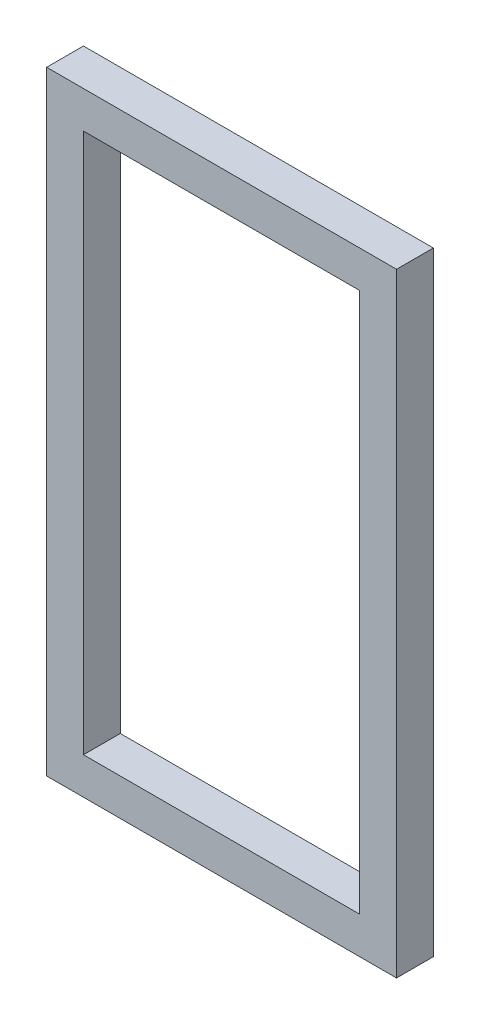
ISO-10303-21;
HEADER;
FILE_DESCRIPTION(('STEP AP214'),'2;1');
FILE_NAME('part.step','',(''),(''),'','','');
FILE_SCHEMA(('AUTOMOTIVE_DESIGN { 1 0 10303 214 1 1 1 1 }'));
ENDSEC;
DATA;
#1=APPLICATION_CONTEXT('core data for automotive mechanical design processes');
#2=APPLICATION_PROTOCOL_DEFINITION('international standard','automotive_design',2000,#1);
#3=PRODUCT_CONTEXT('',#1,'mechanical');
#4=PRODUCT('Part','Part','',(#3));
#5=PRODUCT_RELATED_PRODUCT_CATEGORY('part','',(#4));
#6=PRODUCT_DEFINITION_FORMATION('','',#4);
#7=PRODUCT_DEFINITION_CONTEXT('part definition',#1,'design');
#8=PRODUCT_DEFINITION('design','',#6,#7);
#9=PRODUCT_DEFINITION_SHAPE('','',#8);
#10=(LENGTH_UNIT() NAMED_UNIT(*) SI_UNIT(.MILLI.,.METRE.));
#11=(NAMED_UNIT(*) PLANE_ANGLE_UNIT() SI_UNIT($,.RADIAN.));
#12=(NAMED_UNIT(*) SI_UNIT($,.STERADIAN.) SOLID_ANGLE_UNIT());
#13=UNCERTAINTY_MEASURE_WITH_UNIT(LENGTH_MEASURE(1.E-05),#10,'distance_accuracy_value','');
#14=(GEOMETRIC_REPRESENTATION_CONTEXT(3) GLOBAL_UNCERTAINTY_ASSIGNED_CONTEXT((#13)) GLOBAL_UNIT_ASSIGNED_CONTEXT((#10,
#11,#12)) REPRESENTATION_CONTEXT('',''));
#15=CARTESIAN_POINT('',(0.,0.,0.));
#16=DIRECTION('',(0.,0.,1.));
#17=DIRECTION('',(1.,0.,0.));
#18=AXIS2_PLACEMENT_3D('',#15,#16,#17);
#19=CARTESIAN_POINT('',(-285.,850.,-1395.));
#20=DIRECTION('',(0.,0.,1.));
#21=DIRECTION('',(0.,-1.,0.));
#22=AXIS2_PLACEMENT_3D('',#19,#20,#21);
#23=PLANE('',#22);
#24=DIRECTION('',(0.,-1.,0.));
#25=VECTOR('',#24,1.);
#26=CARTESIAN_POINT('',(-285.,1850.,-1395.));
#27=LINE('',#26,#25);
#28=CARTESIAN_POINT('',(-285.,1850.,-1395.));
#29=VERTEX_POINT('',#28);
#30=CARTESIAN_POINT('',(-285.,850.,-1395.));
#31=VERTEX_POINT('',#30);
#32=EDGE_CURVE('E108',#29,#31,#27,.T.);
#33=ORIENTED_EDGE('',*,*,#32,.T.);
#34=DIRECTION('',(1.,0.,0.));
#35=VECTOR('',#34,1.);
#36=CARTESIAN_POINT('',(-285.,850.,-1395.));
#37=LINE('',#36,#35);
#38=CARTESIAN_POINT('',(285.,850.,-1395.));
#39=VERTEX_POINT('',#38);
#40=EDGE_CURVE('E110',#31,#39,#37,.T.);
#41=ORIENTED_EDGE('',*,*,#40,.T.);
#42=DIRECTION('',(0.,1.,0.));
#43=VECTOR('',#42,1.);
#44=CARTESIAN_POINT('',(285.,850.,-1395.));
#45=LINE('',#44,#43);
#46=CARTESIAN_POINT('',(285.,1850.,-1395.));
#47=VERTEX_POINT('',#46);
#48=EDGE_CURVE('E112',#39,#47,#45,.T.);
#49=ORIENTED_EDGE('',*,*,#48,.T.);
#50=DIRECTION('',(-1.,0.,0.));
#51=VECTOR('',#50,1.);
#52=CARTESIAN_POINT('',(285.,1850.,-1395.));
#53=LINE('',#52,#51);
#54=EDGE_CURVE('E114',#47,#29,#53,.T.);
#55=ORIENTED_EDGE('',*,*,#54,.T.);
#56=EDGE_LOOP('',(#33,#41,#49,#55));
#57=FACE_BOUND('',#56,.T.);
#58=DIRECTION('',(-1.,0.,0.));
#59=VECTOR('',#58,1.);
#60=CARTESIAN_POINT('',(-285.,910.,-1395.));
#61=LINE('',#60,#59);
#62=CARTESIAN_POINT('',(225.,910.,-1395.));
#63=VERTEX_POINT('',#62);
#64=CARTESIAN_POINT('',(-225.,910.,-1395.));
#65=VERTEX_POINT('',#64);
#66=EDGE_CURVE('E95',#63,#65,#61,.T.);
#67=ORIENTED_EDGE('',*,*,#66,.T.);
#68=DIRECTION('',(0.,1.,0.));
#69=VECTOR('',#68,1.);
#70=CARTESIAN_POINT('',(-225.,850.,-1395.));
#71=LINE('',#70,#69);
#72=CARTESIAN_POINT('',(-225.,1790.,-1395.));
#73=VERTEX_POINT('',#72);
#74=EDGE_CURVE('E89',#65,#73,#71,.T.);
#75=ORIENTED_EDGE('',*,*,#74,.T.);
#76=DIRECTION('',(1.,0.,0.));
#77=VECTOR('',#76,1.);
#78=CARTESIAN_POINT('',(-285.,1790.,-1395.));
#79=LINE('',#78,#77);
#80=CARTESIAN_POINT('',(225.,1790.,-1395.));
#81=VERTEX_POINT('',#80);
#82=EDGE_CURVE('E78',#73,#81,#79,.T.);
#83=ORIENTED_EDGE('',*,*,#82,.T.);
#84=DIRECTION('',(0.,-1.,0.));
#85=VECTOR('',#84,1.);
#86=CARTESIAN_POINT('',(225.,850.,-1395.));
#87=LINE('',#86,#85);
#88=EDGE_CURVE('E83',#81,#63,#87,.T.);
#89=ORIENTED_EDGE('',*,*,#88,.T.);
#90=EDGE_LOOP('',(#67,#75,#83,#89));
#91=FACE_BOUND('',#90,.T.);
#92=ADVANCED_FACE('F17',(#57,#91),#23,.T.);
#93=CARTESIAN_POINT('',(-285.,850.,-1455.));
#94=DIRECTION('',(0.,0.,1.));
#95=DIRECTION('',(0.,-1.,0.));
#96=AXIS2_PLACEMENT_3D('',#93,#94,#95);
#97=PLANE('',#96);
#98=DIRECTION('',(0.,-1.,0.));
#99=VECTOR('',#98,1.);
#100=CARTESIAN_POINT('',(-285.,1850.,-1455.));
#101=LINE('',#100,#99);
#102=CARTESIAN_POINT('',(-285.,1850.,-1455.));
#103=VERTEX_POINT('',#102);
#104=CARTESIAN_POINT('',(-285.,850.,-1455.));
#105=VERTEX_POINT('',#104);
#106=EDGE_CURVE('E96',#103,#105,#101,.T.);
#107=ORIENTED_EDGE('',*,*,#106,.F.);
#108=DIRECTION('',(-1.,0.,0.));
#109=VECTOR('',#108,1.);
#110=CARTESIAN_POINT('',(285.,1850.,-1455.));
#111=LINE('',#110,#109);
#112=CARTESIAN_POINT('',(285.,1850.,-1455.));
#113=VERTEX_POINT('',#112);
#114=EDGE_CURVE('E107',#113,#103,#111,.T.);
#115=ORIENTED_EDGE('',*,*,#114,.F.);
#116=DIRECTION('',(0.,1.,0.));
#117=VECTOR('',#116,1.);
#118=CARTESIAN_POINT('',(285.,850.,-1455.));
#119=LINE('',#118,#117);
#120=CARTESIAN_POINT('',(285.,850.,-1455.));
#121=VERTEX_POINT('',#120);
#122=EDGE_CURVE('E105',#121,#113,#119,.T.);
#123=ORIENTED_EDGE('',*,*,#122,.F.);
#124=DIRECTION('',(1.,0.,0.));
#125=VECTOR('',#124,1.);
#126=CARTESIAN_POINT('',(-285.,850.,-1455.));
#127=LINE('',#126,#125);
#128=EDGE_CURVE('E99',#105,#121,#127,.T.);
#129=ORIENTED_EDGE('',*,*,#128,.F.);
#130=EDGE_LOOP('',(#107,#115,#123,#129));
#131=FACE_BOUND('',#130,.T.);
#132=DIRECTION('',(0.,1.,0.));
#133=VECTOR('',#132,1.);
#134=CARTESIAN_POINT('',(-225.,850.,-1455.));
#135=LINE('',#134,#133);
#136=CARTESIAN_POINT('',(-225.,910.,-1455.));
#137=VERTEX_POINT('',#136);
#138=CARTESIAN_POINT('',(-225.,1790.,-1455.));
#139=VERTEX_POINT('',#138);
#140=EDGE_CURVE('E11',#137,#139,#135,.T.);
#141=ORIENTED_EDGE('',*,*,#140,.F.);
#142=DIRECTION('',(-1.,0.,0.));
#143=VECTOR('',#142,1.);
#144=CARTESIAN_POINT('',(-285.,910.,-1455.));
#145=LINE('',#144,#143);
#146=CARTESIAN_POINT('',(225.,910.,-1455.));
#147=VERTEX_POINT('',#146);
#148=EDGE_CURVE('E25',#147,#137,#145,.T.);
#149=ORIENTED_EDGE('',*,*,#148,.F.);
#150=DIRECTION('',(0.,-1.,0.));
#151=VECTOR('',#150,1.);
#152=CARTESIAN_POINT('',(225.,850.,-1455.));
#153=LINE('',#152,#151);
#154=CARTESIAN_POINT('',(225.,1790.,-1455.));
#155=VERTEX_POINT('',#154);
#156=EDGE_CURVE('E132',#155,#147,#153,.T.);
#157=ORIENTED_EDGE('',*,*,#156,.F.);
#158=DIRECTION('',(1.,0.,0.));
#159=VECTOR('',#158,1.);
#160=CARTESIAN_POINT('',(-285.,1790.,-1455.));
#161=LINE('',#160,#159);
#162=EDGE_CURVE('E130',#139,#155,#161,.T.);
#163=ORIENTED_EDGE('',*,*,#162,.F.);
#164=EDGE_LOOP('',(#141,#149,#157,#163));
#165=FACE_BOUND('',#164,.T.);
#166=ADVANCED_FACE('F142',(#131,#165),#97,.F.);
#167=CARTESIAN_POINT('',(-285.,1850.,-1395.));
#168=DIRECTION('',(1.,0.,0.));
#169=DIRECTION('',(0.,1.,0.));
#170=AXIS2_PLACEMENT_3D('',#167,#168,#169);
#171=PLANE('',#170);
#172=ORIENTED_EDGE('',*,*,#106,.T.);
#173=DIRECTION('',(0.,0.,-1.));
#174=VECTOR('',#173,1.);
#175=CARTESIAN_POINT('',(-285.,850.,-1395.));
#176=LINE('',#175,#174);
#177=EDGE_CURVE('E127',#31,#105,#176,.T.);
#178=ORIENTED_EDGE('',*,*,#177,.F.);
#179=ORIENTED_EDGE('',*,*,#32,.F.);
#180=DIRECTION('',(0.,0.,-1.));
#181=VECTOR('',#180,1.);
#182=CARTESIAN_POINT('',(-285.,1850.,-1395.));
#183=LINE('',#182,#181);
#184=EDGE_CURVE('E116',#29,#103,#183,.T.);
#185=ORIENTED_EDGE('',*,*,#184,.T.);
#186=EDGE_LOOP('',(#172,#178,#179,#185));
#187=FACE_BOUND('',#186,.T.);
#188=ADVANCED_FACE('F19',(#187),#171,.F.);
#189=CARTESIAN_POINT('',(-285.,850.,-1395.));
#190=DIRECTION('',(0.,1.,0.));
#191=DIRECTION('',(-1.,0.,0.));
#192=AXIS2_PLACEMENT_3D('',#189,#190,#191);
#193=PLANE('',#192);
#194=ORIENTED_EDGE('',*,*,#128,.T.);
#195=DIRECTION('',(0.,0.,-1.));
#196=VECTOR('',#195,1.);
#197=CARTESIAN_POINT('',(285.,850.,-1395.));
#198=LINE('',#197,#196);
#199=EDGE_CURVE('E124',#39,#121,#198,.T.);
#200=ORIENTED_EDGE('',*,*,#199,.F.);
#201=ORIENTED_EDGE('',*,*,#40,.F.);
#202=ORIENTED_EDGE('',*,*,#177,.T.);
#203=EDGE_LOOP('',(#194,#200,#201,#202));
#204=FACE_BOUND('',#203,.T.);
#205=ADVANCED_FACE('F172',(#204),#193,.F.);
#206=CARTESIAN_POINT('',(285.,850.,-1395.));
#207=DIRECTION('',(-1.,0.,0.));
#208=DIRECTION('',(0.,-1.,0.));
#209=AXIS2_PLACEMENT_3D('',#206,#207,#208);
#210=PLANE('',#209);
#211=ORIENTED_EDGE('',*,*,#122,.T.);
#212=DIRECTION('',(0.,0.,-1.));
#213=VECTOR('',#212,1.);
#214=CARTESIAN_POINT('',(285.,1850.,-1395.));
#215=LINE('',#214,#213);
#216=EDGE_CURVE('E121',#47,#113,#215,.T.);
#217=ORIENTED_EDGE('',*,*,#216,.F.);
#218=ORIENTED_EDGE('',*,*,#48,.F.);
#219=ORIENTED_EDGE('',*,*,#199,.T.);
#220=EDGE_LOOP('',(#211,#217,#218,#219));
#221=FACE_BOUND('',#220,.T.);
#222=ADVANCED_FACE('F169',(#221),#210,.F.);
#223=CARTESIAN_POINT('',(285.,1850.,-1395.));
#224=DIRECTION('',(0.,-1.,0.));
#225=DIRECTION('',(1.,0.,0.));
#226=AXIS2_PLACEMENT_3D('',#223,#224,#225);
#227=PLANE('',#226);
#228=ORIENTED_EDGE('',*,*,#114,.T.);
#229=ORIENTED_EDGE('',*,*,#184,.F.);
#230=ORIENTED_EDGE('',*,*,#54,.F.);
#231=ORIENTED_EDGE('',*,*,#216,.T.);
#232=EDGE_LOOP('',(#228,#229,#230,#231));
#233=FACE_BOUND('',#232,.T.);
#234=ADVANCED_FACE('F166',(#233),#227,.F.);
#235=CARTESIAN_POINT('',(-225.,1790.,910.211487044084));
#236=DIRECTION('',(1.,0.,0.));
#237=DIRECTION('',(0.,1.,0.));
#238=AXIS2_PLACEMENT_3D('',#235,#236,#237);
#239=PLANE('',#238);
#240=DIRECTION('',(0.,0.,-1.));
#241=VECTOR('',#240,1.);
#242=CARTESIAN_POINT('',(-225.,910.,910.211487044084));
#243=LINE('',#242,#241);
#244=EDGE_CURVE('E84',#65,#137,#243,.T.);
#245=ORIENTED_EDGE('',*,*,#244,.T.);
#246=ORIENTED_EDGE('',*,*,#140,.T.);
#247=DIRECTION('',(0.,0.,-1.));
#248=VECTOR('',#247,1.);
#249=CARTESIAN_POINT('',(-225.,1790.,910.211487044084));
#250=LINE('',#249,#248);
#251=EDGE_CURVE('E37',#73,#139,#250,.T.);
#252=ORIENTED_EDGE('',*,*,#251,.F.);
#253=ORIENTED_EDGE('',*,*,#74,.F.);
#254=EDGE_LOOP('',(#245,#246,#252,#253));
#255=FACE_BOUND('',#254,.T.);
#256=ADVANCED_FACE('F88',(#255),#239,.T.);
#257=CARTESIAN_POINT('',(-225.,910.,910.211487044084));
#258=DIRECTION('',(0.,1.,0.));
#259=DIRECTION('',(-1.,0.,0.));
#260=AXIS2_PLACEMENT_3D('',#257,#258,#259);
#261=PLANE('',#260);
#262=DIRECTION('',(0.,0.,-1.));
#263=VECTOR('',#262,1.);
#264=CARTESIAN_POINT('',(225.,910.,910.211487044084));
#265=LINE('',#264,#263);
#266=EDGE_CURVE('E138',#63,#147,#265,.T.);
#267=ORIENTED_EDGE('',*,*,#266,.T.);
#268=ORIENTED_EDGE('',*,*,#148,.T.);
#269=ORIENTED_EDGE('',*,*,#244,.F.);
#270=ORIENTED_EDGE('',*,*,#66,.F.);
#271=EDGE_LOOP('',(#267,#268,#269,#270));
#272=FACE_BOUND('',#271,.T.);
#273=ADVANCED_FACE('F136',(#272),#261,.T.);
#274=CARTESIAN_POINT('',(225.,910.,910.211487044084));
#275=DIRECTION('',(-1.,0.,0.));
#276=DIRECTION('',(0.,-1.,0.));
#277=AXIS2_PLACEMENT_3D('',#274,#275,#276);
#278=PLANE('',#277);
#279=DIRECTION('',(0.,0.,-1.));
#280=VECTOR('',#279,1.);
#281=CARTESIAN_POINT('',(225.,1790.,910.211487044084));
#282=LINE('',#281,#280);
#283=EDGE_CURVE('E32',#81,#155,#282,.T.);
#284=ORIENTED_EDGE('',*,*,#283,.T.);
#285=ORIENTED_EDGE('',*,*,#156,.T.);
#286=ORIENTED_EDGE('',*,*,#266,.F.);
#287=ORIENTED_EDGE('',*,*,#88,.F.);
#288=EDGE_LOOP('',(#284,#285,#286,#287));
#289=FACE_BOUND('',#288,.T.);
#290=ADVANCED_FACE('F144',(#289),#278,.T.);
#291=CARTESIAN_POINT('',(225.,1790.,910.211487044084));
#292=DIRECTION('',(0.,-1.,0.));
#293=DIRECTION('',(1.,0.,0.));
#294=AXIS2_PLACEMENT_3D('',#291,#292,#293);
#295=PLANE('',#294);
#296=ORIENTED_EDGE('',*,*,#251,.T.);
#297=ORIENTED_EDGE('',*,*,#162,.T.);
#298=ORIENTED_EDGE('',*,*,#283,.F.);
#299=ORIENTED_EDGE('',*,*,#82,.F.);
#300=EDGE_LOOP('',(#296,#297,#298,#299));
#301=FACE_BOUND('',#300,.T.);
#302=ADVANCED_FACE('F79',(#301),#295,.T.);
#303=CLOSED_SHELL('',(#92,#166,#188,#205,#222,#234,#256,#273,#290,#302));
#304=MANIFOLD_SOLID_BREP('B1',#303);
#305=ADVANCED_BREP_SHAPE_REPRESENTATION('',(#18,#304),#14);
#306=SHAPE_DEFINITION_REPRESENTATION(#9,#305);
ENDSEC;
END-ISO-10303-21;
